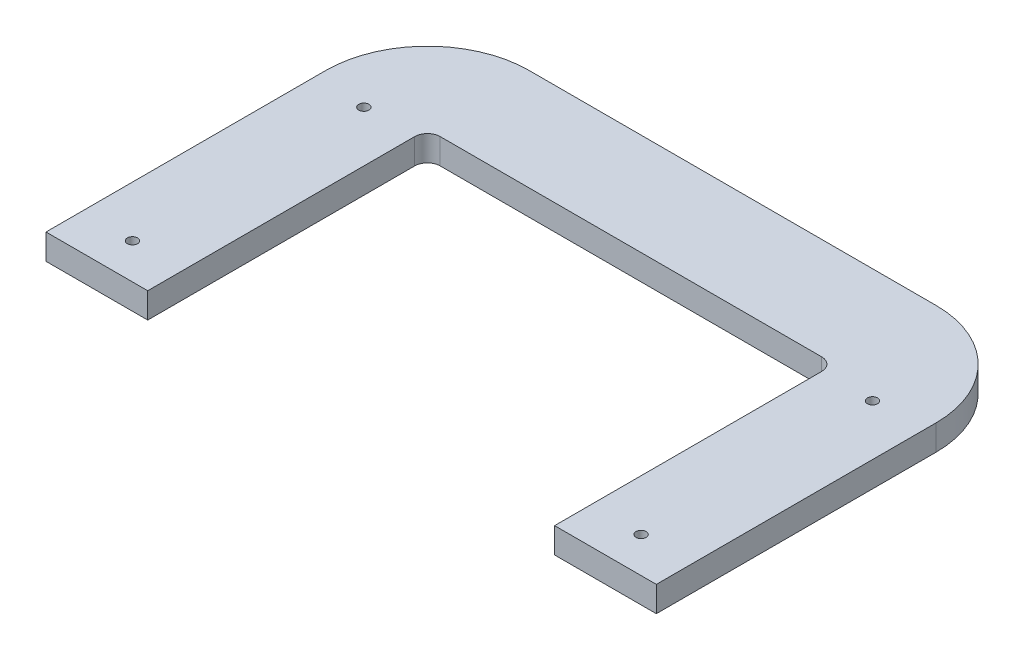
ISO-10303-21;
HEADER;
FILE_DESCRIPTION(('STEP AP214'),'2;1');
FILE_NAME('part.step','',(''),(''),'','','');
FILE_SCHEMA(('AUTOMOTIVE_DESIGN { 1 0 10303 214 1 1 1 1 }'));
ENDSEC;
DATA;
#1=APPLICATION_CONTEXT('core data for automotive mechanical design processes');
#2=APPLICATION_PROTOCOL_DEFINITION('international standard','automotive_design',2000,#1);
#3=PRODUCT_CONTEXT('',#1,'mechanical');
#4=PRODUCT('Part','Part','',(#3));
#5=PRODUCT_RELATED_PRODUCT_CATEGORY('part','',(#4));
#6=PRODUCT_DEFINITION_FORMATION('','',#4);
#7=PRODUCT_DEFINITION_CONTEXT('part definition',#1,'design');
#8=PRODUCT_DEFINITION('design','',#6,#7);
#9=PRODUCT_DEFINITION_SHAPE('','',#8);
#10=(LENGTH_UNIT() NAMED_UNIT(*) SI_UNIT(.MILLI.,.METRE.));
#11=(NAMED_UNIT(*) PLANE_ANGLE_UNIT() SI_UNIT($,.RADIAN.));
#12=(NAMED_UNIT(*) SI_UNIT($,.STERADIAN.) SOLID_ANGLE_UNIT());
#13=UNCERTAINTY_MEASURE_WITH_UNIT(LENGTH_MEASURE(1.E-05),#10,'distance_accuracy_value','');
#14=(GEOMETRIC_REPRESENTATION_CONTEXT(3) GLOBAL_UNCERTAINTY_ASSIGNED_CONTEXT((#13)) GLOBAL_UNIT_ASSIGNED_CONTEXT((#10,
#11,#12)) REPRESENTATION_CONTEXT('',''));
#15=CARTESIAN_POINT('',(0.,0.,0.));
#16=DIRECTION('',(0.,0.,1.));
#17=DIRECTION('',(1.,0.,0.));
#18=AXIS2_PLACEMENT_3D('',#15,#16,#17);
#19=CARTESIAN_POINT('',(0.,10.,0.));
#20=DIRECTION('',(0.,-1.,0.));
#21=DIRECTION('',(0.,0.,-1.));
#22=AXIS2_PLACEMENT_3D('',#19,#20,#21);
#23=PLANE('',#22);
#24=DIRECTION('',(0.,0.,-1.));
#25=VECTOR('',#24,1.);
#26=CARTESIAN_POINT('',(120.,10.,-142.12555673157));
#27=LINE('',#26,#25);
#28=CARTESIAN_POINT('',(120.,10.,7.87444326843044));
#29=VERTEX_POINT('',#28);
#30=CARTESIAN_POINT('',(120.,10.,-102.12555673157));
#31=VERTEX_POINT('',#30);
#32=EDGE_CURVE('E231',#29,#31,#27,.T.);
#33=ORIENTED_EDGE('',*,*,#32,.T.);
#34=CARTESIAN_POINT('',(80.,10.,-102.12555673157));
#35=DIRECTION('',(0.,-1.,0.));
#36=DIRECTION('',(0.,0.,-1.));
#37=AXIS2_PLACEMENT_3D('',#34,#35,#36);
#38=CIRCLE('',#37,40.);
#39=CARTESIAN_POINT('',(80.,10.,-142.12555673157));
#40=VERTEX_POINT('',#39);
#41=EDGE_CURVE('E165',#31,#40,#38,.F.);
#42=ORIENTED_EDGE('',*,*,#41,.T.);
#43=DIRECTION('',(-1.,0.,0.));
#44=VECTOR('',#43,1.);
#45=CARTESIAN_POINT('',(-120.,10.,-142.12555673157));
#46=LINE('',#45,#44);
#47=CARTESIAN_POINT('',(-80.,10.,-142.12555673157));
#48=VERTEX_POINT('',#47);
#49=EDGE_CURVE('E242',#40,#48,#46,.T.);
#50=ORIENTED_EDGE('',*,*,#49,.T.);
#51=CARTESIAN_POINT('',(-80.,10.,-102.12555673157));
#52=DIRECTION('',(0.,-1.,0.));
#53=DIRECTION('',(0.,0.,-1.));
#54=AXIS2_PLACEMENT_3D('',#51,#52,#53);
#55=CIRCLE('',#54,40.);
#56=CARTESIAN_POINT('',(-120.,10.,-102.12555673157));
#57=VERTEX_POINT('',#56);
#58=EDGE_CURVE('E163',#48,#57,#55,.F.);
#59=ORIENTED_EDGE('',*,*,#58,.T.);
#60=DIRECTION('',(0.,0.,1.));
#61=VECTOR('',#60,1.);
#62=CARTESIAN_POINT('',(-120.,10.,-142.12555673157));
#63=LINE('',#62,#61);
#64=CARTESIAN_POINT('',(-120.,10.,7.87444326843044));
#65=VERTEX_POINT('',#64);
#66=EDGE_CURVE('E136',#57,#65,#63,.T.);
#67=ORIENTED_EDGE('',*,*,#66,.T.);
#68=DIRECTION('',(1.,0.,0.));
#69=VECTOR('',#68,1.);
#70=CARTESIAN_POINT('',(-120.,10.,7.87444326843044));
#71=LINE('',#70,#69);
#72=CARTESIAN_POINT('',(-80.,10.,7.87444326843044));
#73=VERTEX_POINT('',#72);
#74=EDGE_CURVE('E130',#65,#73,#71,.T.);
#75=ORIENTED_EDGE('',*,*,#74,.T.);
#76=DIRECTION('',(0.,0.,-1.));
#77=VECTOR('',#76,1.);
#78=CARTESIAN_POINT('',(-80.,10.,-102.12555673157));
#79=LINE('',#78,#77);
#80=CARTESIAN_POINT('',(-80.,10.,-97.1255567315696));
#81=VERTEX_POINT('',#80);
#82=EDGE_CURVE('E121',#73,#81,#79,.T.);
#83=ORIENTED_EDGE('',*,*,#82,.T.);
#84=CARTESIAN_POINT('',(-75.,10.,-97.1255567315696));
#85=DIRECTION('',(0.,-1.,0.));
#86=DIRECTION('',(0.,0.,-1.));
#87=AXIS2_PLACEMENT_3D('',#84,#85,#86);
#88=CIRCLE('',#87,5.);
#89=CARTESIAN_POINT('',(-75.,10.,-102.12555673157));
#90=VERTEX_POINT('',#89);
#91=EDGE_CURVE('E11',#81,#90,#88,.T.);
#92=ORIENTED_EDGE('',*,*,#91,.T.);
#93=DIRECTION('',(1.,0.,0.));
#94=VECTOR('',#93,1.);
#95=CARTESIAN_POINT('',(-80.,10.,-102.12555673157));
#96=LINE('',#95,#94);
#97=CARTESIAN_POINT('',(75.,10.,-102.12555673157));
#98=VERTEX_POINT('',#97);
#99=EDGE_CURVE('E129',#90,#98,#96,.T.);
#100=ORIENTED_EDGE('',*,*,#99,.T.);
#101=CARTESIAN_POINT('',(75.,10.,-97.1255567315696));
#102=DIRECTION('',(0.,-1.,0.));
#103=DIRECTION('',(0.,0.,-1.));
#104=AXIS2_PLACEMENT_3D('',#101,#102,#103);
#105=CIRCLE('',#104,5.);
#106=CARTESIAN_POINT('',(80.,10.,-97.1255567315696));
#107=VERTEX_POINT('',#106);
#108=EDGE_CURVE('E181',#98,#107,#105,.T.);
#109=ORIENTED_EDGE('',*,*,#108,.T.);
#110=DIRECTION('',(0.,0.,1.));
#111=VECTOR('',#110,1.);
#112=CARTESIAN_POINT('',(80.,10.,-102.12555673157));
#113=LINE('',#112,#111);
#114=CARTESIAN_POINT('',(80.,10.,7.87444326843044));
#115=VERTEX_POINT('',#114);
#116=EDGE_CURVE('E185',#107,#115,#113,.T.);
#117=ORIENTED_EDGE('',*,*,#116,.T.);
#118=DIRECTION('',(1.,0.,0.));
#119=VECTOR('',#118,1.);
#120=CARTESIAN_POINT('',(120.,10.,7.87444326843044));
#121=LINE('',#120,#119);
#122=EDGE_CURVE('E195',#115,#29,#121,.T.);
#123=ORIENTED_EDGE('',*,*,#122,.T.);
#124=EDGE_LOOP('',(#33,#42,#50,#59,#67,#75,#83,#92,#100,#109,#117,#123));
#125=FACE_BOUND('',#124,.T.);
#126=CARTESIAN_POINT('',(-100.,10.,-97.1255567315696));
#127=DIRECTION('',(0.,1.,0.));
#128=DIRECTION('',(0.,0.,1.));
#129=AXIS2_PLACEMENT_3D('',#126,#127,#128);
#130=CIRCLE('',#129,2.);
#131=CARTESIAN_POINT('',(-100.,10.,-95.1255567315696));
#132=VERTEX_POINT('',#131);
#133=EDGE_CURVE('E248',#132,#132,#130,.T.);
#134=ORIENTED_EDGE('',*,*,#133,.F.);
#135=EDGE_LOOP('',(#134));
#136=FACE_BOUND('',#135,.T.);
#137=CARTESIAN_POINT('',(100.,10.,-97.1255567315696));
#138=DIRECTION('',(0.,1.,0.));
#139=DIRECTION('',(0.,0.,-1.));
#140=AXIS2_PLACEMENT_3D('',#137,#138,#139);
#141=CIRCLE('',#140,2.);
#142=CARTESIAN_POINT('',(100.,10.,-99.1255567315696));
#143=VERTEX_POINT('',#142);
#144=EDGE_CURVE('E255',#143,#143,#141,.T.);
#145=ORIENTED_EDGE('',*,*,#144,.F.);
#146=EDGE_LOOP('',(#145));
#147=FACE_BOUND('',#146,.T.);
#148=CARTESIAN_POINT('',(-100.,10.,-6.12555673156957));
#149=DIRECTION('',(0.,1.,0.));
#150=DIRECTION('',(0.,0.,1.));
#151=AXIS2_PLACEMENT_3D('',#148,#149,#150);
#152=CIRCLE('',#151,2.);
#153=CARTESIAN_POINT('',(-100.,10.,-4.12555673156958));
#154=VERTEX_POINT('',#153);
#155=EDGE_CURVE('E431',#154,#154,#152,.T.);
#156=ORIENTED_EDGE('',*,*,#155,.F.);
#157=EDGE_LOOP('',(#156));
#158=FACE_BOUND('',#157,.T.);
#159=CARTESIAN_POINT('',(100.,10.,-6.12555673156957));
#160=DIRECTION('',(0.,1.,0.));
#161=DIRECTION('',(0.,0.,-1.));
#162=AXIS2_PLACEMENT_3D('',#159,#160,#161);
#163=CIRCLE('',#162,2.);
#164=CARTESIAN_POINT('',(100.,10.,-8.12555673156957));
#165=VERTEX_POINT('',#164);
#166=EDGE_CURVE('E422',#165,#165,#163,.T.);
#167=ORIENTED_EDGE('',*,*,#166,.F.);
#168=EDGE_LOOP('',(#167));
#169=FACE_BOUND('',#168,.T.);
#170=ADVANCED_FACE('F36',(#125,#136,#147,#158,#169),#23,.F.);
#171=CARTESIAN_POINT('',(0.,0.,0.));
#172=DIRECTION('',(0.,-1.,0.));
#173=DIRECTION('',(0.,0.,-1.));
#174=AXIS2_PLACEMENT_3D('',#171,#172,#173);
#175=PLANE('',#174);
#176=CARTESIAN_POINT('',(-100.,0.,-6.12555673156957));
#177=DIRECTION('',(0.,1.,0.));
#178=DIRECTION('',(0.,0.,1.));
#179=AXIS2_PLACEMENT_3D('',#176,#177,#178);
#180=CIRCLE('',#179,2.);
#181=CARTESIAN_POINT('',(-100.,0.,-4.12555673156958));
#182=VERTEX_POINT('',#181);
#183=EDGE_CURVE('E428',#182,#182,#180,.T.);
#184=ORIENTED_EDGE('',*,*,#183,.T.);
#185=EDGE_LOOP('',(#184));
#186=FACE_BOUND('',#185,.T.);
#187=CARTESIAN_POINT('',(-100.,0.,-97.1255567315696));
#188=DIRECTION('',(0.,1.,0.));
#189=DIRECTION('',(0.,0.,1.));
#190=AXIS2_PLACEMENT_3D('',#187,#188,#189);
#191=CIRCLE('',#190,2.);
#192=CARTESIAN_POINT('',(-100.,0.,-95.1255567315696));
#193=VERTEX_POINT('',#192);
#194=EDGE_CURVE('E250',#193,#193,#191,.T.);
#195=ORIENTED_EDGE('',*,*,#194,.T.);
#196=EDGE_LOOP('',(#195));
#197=FACE_BOUND('',#196,.T.);
#198=DIRECTION('',(-1.,0.,0.));
#199=VECTOR('',#198,1.);
#200=CARTESIAN_POINT('',(-120.,0.,-142.12555673157));
#201=LINE('',#200,#199);
#202=CARTESIAN_POINT('',(80.,0.,-142.12555673157));
#203=VERTEX_POINT('',#202);
#204=CARTESIAN_POINT('',(-80.,0.,-142.12555673157));
#205=VERTEX_POINT('',#204);
#206=EDGE_CURVE('E219',#203,#205,#201,.T.);
#207=ORIENTED_EDGE('',*,*,#206,.F.);
#208=CARTESIAN_POINT('',(80.,0.,-102.12555673157));
#209=DIRECTION('',(0.,-1.,0.));
#210=DIRECTION('',(0.,0.,-1.));
#211=AXIS2_PLACEMENT_3D('',#208,#209,#210);
#212=CIRCLE('',#211,40.);
#213=CARTESIAN_POINT('',(120.,0.,-102.12555673157));
#214=VERTEX_POINT('',#213);
#215=EDGE_CURVE('E159',#203,#214,#212,.T.);
#216=ORIENTED_EDGE('',*,*,#215,.T.);
#217=DIRECTION('',(0.,0.,-1.));
#218=VECTOR('',#217,1.);
#219=CARTESIAN_POINT('',(120.,0.,-142.12555673157));
#220=LINE('',#219,#218);
#221=CARTESIAN_POINT('',(120.,0.,7.87444326843044));
#222=VERTEX_POINT('',#221);
#223=EDGE_CURVE('E216',#222,#214,#220,.T.);
#224=ORIENTED_EDGE('',*,*,#223,.F.);
#225=DIRECTION('',(1.,0.,0.));
#226=VECTOR('',#225,1.);
#227=CARTESIAN_POINT('',(120.,0.,7.87444326843044));
#228=LINE('',#227,#226);
#229=CARTESIAN_POINT('',(80.,0.,7.87444326843044));
#230=VERTEX_POINT('',#229);
#231=EDGE_CURVE('E210',#230,#222,#228,.T.);
#232=ORIENTED_EDGE('',*,*,#231,.F.);
#233=DIRECTION('',(0.,0.,1.));
#234=VECTOR('',#233,1.);
#235=CARTESIAN_POINT('',(80.,0.,-102.12555673157));
#236=LINE('',#235,#234);
#237=CARTESIAN_POINT('',(80.,0.,-97.1255567315696));
#238=VERTEX_POINT('',#237);
#239=EDGE_CURVE('E204',#238,#230,#236,.T.);
#240=ORIENTED_EDGE('',*,*,#239,.F.);
#241=CARTESIAN_POINT('',(75.,0.,-97.1255567315696));
#242=DIRECTION('',(0.,-1.,0.));
#243=DIRECTION('',(0.,0.,-1.));
#244=AXIS2_PLACEMENT_3D('',#241,#242,#243);
#245=CIRCLE('',#244,5.);
#246=CARTESIAN_POINT('',(75.,0.,-102.12555673157));
#247=VERTEX_POINT('',#246);
#248=EDGE_CURVE('E179',#238,#247,#245,.F.);
#249=ORIENTED_EDGE('',*,*,#248,.T.);
#250=DIRECTION('',(1.,0.,0.));
#251=VECTOR('',#250,1.);
#252=CARTESIAN_POINT('',(-80.,0.,-102.12555673157));
#253=LINE('',#252,#251);
#254=CARTESIAN_POINT('',(-75.,0.,-102.12555673157));
#255=VERTEX_POINT('',#254);
#256=EDGE_CURVE('E202',#255,#247,#253,.T.);
#257=ORIENTED_EDGE('',*,*,#256,.F.);
#258=CARTESIAN_POINT('',(-75.,0.,-97.1255567315696));
#259=DIRECTION('',(0.,-1.,0.));
#260=DIRECTION('',(0.,0.,-1.));
#261=AXIS2_PLACEMENT_3D('',#258,#259,#260);
#262=CIRCLE('',#261,5.);
#263=CARTESIAN_POINT('',(-80.,0.,-97.1255567315696));
#264=VERTEX_POINT('',#263);
#265=EDGE_CURVE('E44',#255,#264,#262,.F.);
#266=ORIENTED_EDGE('',*,*,#265,.T.);
#267=DIRECTION('',(0.,0.,-1.));
#268=VECTOR('',#267,1.);
#269=CARTESIAN_POINT('',(-80.,0.,-102.12555673157));
#270=LINE('',#269,#268);
#271=CARTESIAN_POINT('',(-80.,0.,7.87444326843044));
#272=VERTEX_POINT('',#271);
#273=EDGE_CURVE('E208',#272,#264,#270,.T.);
#274=ORIENTED_EDGE('',*,*,#273,.F.);
#275=DIRECTION('',(1.,0.,0.));
#276=VECTOR('',#275,1.);
#277=CARTESIAN_POINT('',(-120.,0.,7.87444326843044));
#278=LINE('',#277,#276);
#279=CARTESIAN_POINT('',(-120.,0.,7.87444326843044));
#280=VERTEX_POINT('',#279);
#281=EDGE_CURVE('E144',#280,#272,#278,.T.);
#282=ORIENTED_EDGE('',*,*,#281,.F.);
#283=DIRECTION('',(0.,0.,1.));
#284=VECTOR('',#283,1.);
#285=CARTESIAN_POINT('',(-120.,0.,-142.12555673157));
#286=LINE('',#285,#284);
#287=CARTESIAN_POINT('',(-120.,0.,-102.12555673157));
#288=VERTEX_POINT('',#287);
#289=EDGE_CURVE('E140',#288,#280,#286,.T.);
#290=ORIENTED_EDGE('',*,*,#289,.F.);
#291=CARTESIAN_POINT('',(-80.,0.,-102.12555673157));
#292=DIRECTION('',(0.,-1.,0.));
#293=DIRECTION('',(0.,0.,-1.));
#294=AXIS2_PLACEMENT_3D('',#291,#292,#293);
#295=CIRCLE('',#294,40.);
#296=EDGE_CURVE('E157',#288,#205,#295,.T.);
#297=ORIENTED_EDGE('',*,*,#296,.T.);
#298=EDGE_LOOP('',(#207,#216,#224,#232,#240,#249,#257,#266,#274,#282,#290,#297));
#299=FACE_BOUND('',#298,.T.);
#300=CARTESIAN_POINT('',(100.,0.,-97.1255567315696));
#301=DIRECTION('',(0.,1.,0.));
#302=DIRECTION('',(0.,0.,-1.));
#303=AXIS2_PLACEMENT_3D('',#300,#301,#302);
#304=CIRCLE('',#303,2.);
#305=CARTESIAN_POINT('',(100.,0.,-99.1255567315696));
#306=VERTEX_POINT('',#305);
#307=EDGE_CURVE('E258',#306,#306,#304,.T.);
#308=ORIENTED_EDGE('',*,*,#307,.T.);
#309=EDGE_LOOP('',(#308));
#310=FACE_BOUND('',#309,.T.);
#311=CARTESIAN_POINT('',(100.,0.,-6.12555673156957));
#312=DIRECTION('',(0.,1.,0.));
#313=DIRECTION('',(0.,0.,-1.));
#314=AXIS2_PLACEMENT_3D('',#311,#312,#313);
#315=CIRCLE('',#314,2.);
#316=CARTESIAN_POINT('',(100.,0.,-8.12555673156957));
#317=VERTEX_POINT('',#316);
#318=EDGE_CURVE('E425',#317,#317,#315,.T.);
#319=ORIENTED_EDGE('',*,*,#318,.T.);
#320=EDGE_LOOP('',(#319));
#321=FACE_BOUND('',#320,.T.);
#322=ADVANCED_FACE('F200',(#186,#197,#299,#310,#321),#175,.T.);
#323=CARTESIAN_POINT('',(-120.,10.,7.87444326843044));
#324=DIRECTION('',(0.,0.,-1.));
#325=DIRECTION('',(-1.,0.,0.));
#326=AXIS2_PLACEMENT_3D('',#323,#324,#325);
#327=PLANE('',#326);
#328=ORIENTED_EDGE('',*,*,#281,.T.);
#329=DIRECTION('',(0.,-1.,0.));
#330=VECTOR('',#329,1.);
#331=CARTESIAN_POINT('',(-80.,10.,7.87444326843044));
#332=LINE('',#331,#330);
#333=EDGE_CURVE('E125',#73,#272,#332,.T.);
#334=ORIENTED_EDGE('',*,*,#333,.F.);
#335=ORIENTED_EDGE('',*,*,#74,.F.);
#336=DIRECTION('',(0.,-1.,0.));
#337=VECTOR('',#336,1.);
#338=CARTESIAN_POINT('',(-120.,10.,7.87444326843044));
#339=LINE('',#338,#337);
#340=EDGE_CURVE('E223',#65,#280,#339,.T.);
#341=ORIENTED_EDGE('',*,*,#340,.T.);
#342=EDGE_LOOP('',(#328,#334,#335,#341));
#343=FACE_BOUND('',#342,.T.);
#344=ADVANCED_FACE('F142',(#343),#327,.F.);
#345=CARTESIAN_POINT('',(-80.,10.,-102.12555673157));
#346=DIRECTION('',(-1.,0.,0.));
#347=DIRECTION('',(0.,0.,1.));
#348=AXIS2_PLACEMENT_3D('',#345,#346,#347);
#349=PLANE('',#348);
#350=ORIENTED_EDGE('',*,*,#273,.T.);
#351=DIRECTION('',(0.,-1.,0.));
#352=VECTOR('',#351,1.);
#353=CARTESIAN_POINT('',(-80.,10.,-97.1255567315696));
#354=LINE('',#353,#352);
#355=EDGE_CURVE('E51',#264,#81,#354,.F.);
#356=ORIENTED_EDGE('',*,*,#355,.T.);
#357=ORIENTED_EDGE('',*,*,#82,.F.);
#358=ORIENTED_EDGE('',*,*,#333,.T.);
#359=EDGE_LOOP('',(#350,#356,#357,#358));
#360=FACE_BOUND('',#359,.T.);
#361=ADVANCED_FACE('F123',(#360),#349,.F.);
#362=CARTESIAN_POINT('',(-80.,10.,-102.12555673157));
#363=DIRECTION('',(0.,0.,-1.));
#364=DIRECTION('',(-1.,0.,0.));
#365=AXIS2_PLACEMENT_3D('',#362,#363,#364);
#366=PLANE('',#365);
#367=ORIENTED_EDGE('',*,*,#256,.T.);
#368=DIRECTION('',(0.,-1.,0.));
#369=VECTOR('',#368,1.);
#370=CARTESIAN_POINT('',(75.,10.,-102.12555673157));
#371=LINE('',#370,#369);
#372=EDGE_CURVE('E176',#247,#98,#371,.F.);
#373=ORIENTED_EDGE('',*,*,#372,.T.);
#374=ORIENTED_EDGE('',*,*,#99,.F.);
#375=DIRECTION('',(0.,-1.,0.));
#376=VECTOR('',#375,1.);
#377=CARTESIAN_POINT('',(-75.,0.,-102.12555673157));
#378=LINE('',#377,#376);
#379=EDGE_CURVE('E173',#90,#255,#378,.T.);
#380=ORIENTED_EDGE('',*,*,#379,.T.);
#381=EDGE_LOOP('',(#367,#373,#374,#380));
#382=FACE_BOUND('',#381,.T.);
#383=ADVANCED_FACE('F206',(#382),#366,.F.);
#384=CARTESIAN_POINT('',(80.,10.,-102.12555673157));
#385=DIRECTION('',(1.,0.,0.));
#386=DIRECTION('',(0.,0.,-1.));
#387=AXIS2_PLACEMENT_3D('',#384,#385,#386);
#388=PLANE('',#387);
#389=ORIENTED_EDGE('',*,*,#116,.F.);
#390=DIRECTION('',(0.,-1.,0.));
#391=VECTOR('',#390,1.);
#392=CARTESIAN_POINT('',(80.,0.,-97.1255567315696));
#393=LINE('',#392,#391);
#394=EDGE_CURVE('E170',#107,#238,#393,.T.);
#395=ORIENTED_EDGE('',*,*,#394,.T.);
#396=ORIENTED_EDGE('',*,*,#239,.T.);
#397=DIRECTION('',(0.,-1.,0.));
#398=VECTOR('',#397,1.);
#399=CARTESIAN_POINT('',(80.,10.,7.87444326843044));
#400=LINE('',#399,#398);
#401=EDGE_CURVE('E146',#115,#230,#400,.T.);
#402=ORIENTED_EDGE('',*,*,#401,.F.);
#403=EDGE_LOOP('',(#389,#395,#396,#402));
#404=FACE_BOUND('',#403,.T.);
#405=ADVANCED_FACE('F192',(#404),#388,.F.);
#406=CARTESIAN_POINT('',(120.,10.,7.87444326843044));
#407=DIRECTION('',(0.,0.,-1.));
#408=DIRECTION('',(-1.,0.,0.));
#409=AXIS2_PLACEMENT_3D('',#406,#407,#408);
#410=PLANE('',#409);
#411=ORIENTED_EDGE('',*,*,#231,.T.);
#412=DIRECTION('',(0.,-1.,0.));
#413=VECTOR('',#412,1.);
#414=CARTESIAN_POINT('',(120.,10.,7.87444326843044));
#415=LINE('',#414,#413);
#416=EDGE_CURVE('E151',#29,#222,#415,.T.);
#417=ORIENTED_EDGE('',*,*,#416,.F.);
#418=ORIENTED_EDGE('',*,*,#122,.F.);
#419=ORIENTED_EDGE('',*,*,#401,.T.);
#420=EDGE_LOOP('',(#411,#417,#418,#419));
#421=FACE_BOUND('',#420,.T.);
#422=ADVANCED_FACE('F261',(#421),#410,.F.);
#423=CARTESIAN_POINT('',(120.,10.,-142.12555673157));
#424=DIRECTION('',(-1.,0.,0.));
#425=DIRECTION('',(0.,0.,1.));
#426=AXIS2_PLACEMENT_3D('',#423,#424,#425);
#427=PLANE('',#426);
#428=ORIENTED_EDGE('',*,*,#223,.T.);
#429=DIRECTION('',(0.,-1.,0.));
#430=VECTOR('',#429,1.);
#431=CARTESIAN_POINT('',(120.,10.,-102.12555673157));
#432=LINE('',#431,#430);
#433=EDGE_CURVE('E161',#214,#31,#432,.F.);
#434=ORIENTED_EDGE('',*,*,#433,.T.);
#435=ORIENTED_EDGE('',*,*,#32,.F.);
#436=ORIENTED_EDGE('',*,*,#416,.T.);
#437=EDGE_LOOP('',(#428,#434,#435,#436));
#438=FACE_BOUND('',#437,.T.);
#439=ADVANCED_FACE('F229',(#438),#427,.F.);
#440=CARTESIAN_POINT('',(-120.,10.,-142.12555673157));
#441=DIRECTION('',(0.,0.,1.));
#442=DIRECTION('',(1.,0.,0.));
#443=AXIS2_PLACEMENT_3D('',#440,#441,#442);
#444=PLANE('',#443);
#445=ORIENTED_EDGE('',*,*,#49,.F.);
#446=DIRECTION('',(0.,-1.,0.));
#447=VECTOR('',#446,1.);
#448=CARTESIAN_POINT('',(80.,10.,-142.12555673157));
#449=LINE('',#448,#447);
#450=EDGE_CURVE('E148',#40,#203,#449,.T.);
#451=ORIENTED_EDGE('',*,*,#450,.T.);
#452=ORIENTED_EDGE('',*,*,#206,.T.);
#453=DIRECTION('',(0.,-1.,0.));
#454=VECTOR('',#453,1.);
#455=CARTESIAN_POINT('',(-80.,10.,-142.12555673157));
#456=LINE('',#455,#454);
#457=EDGE_CURVE('E145',#205,#48,#456,.F.);
#458=ORIENTED_EDGE('',*,*,#457,.T.);
#459=EDGE_LOOP('',(#445,#451,#452,#458));
#460=FACE_BOUND('',#459,.T.);
#461=ADVANCED_FACE('F239',(#460),#444,.F.);
#462=CARTESIAN_POINT('',(-120.,10.,-142.12555673157));
#463=DIRECTION('',(1.,0.,0.));
#464=DIRECTION('',(0.,0.,-1.));
#465=AXIS2_PLACEMENT_3D('',#462,#463,#464);
#466=PLANE('',#465);
#467=ORIENTED_EDGE('',*,*,#66,.F.);
#468=DIRECTION('',(0.,-1.,0.));
#469=VECTOR('',#468,1.);
#470=CARTESIAN_POINT('',(-120.,10.,-102.12555673157));
#471=LINE('',#470,#469);
#472=EDGE_CURVE('E167',#57,#288,#471,.T.);
#473=ORIENTED_EDGE('',*,*,#472,.T.);
#474=ORIENTED_EDGE('',*,*,#289,.T.);
#475=ORIENTED_EDGE('',*,*,#340,.F.);
#476=EDGE_LOOP('',(#467,#473,#474,#475));
#477=FACE_BOUND('',#476,.T.);
#478=ADVANCED_FACE('F281',(#477),#466,.F.);
#479=CARTESIAN_POINT('',(-100.,10.,-97.1255567315696));
#480=DIRECTION('',(0.,-1.,0.));
#481=DIRECTION('',(0.,0.,-1.));
#482=AXIS2_PLACEMENT_3D('',#479,#480,#481);
#483=CYLINDRICAL_SURFACE('',#482,2.);
#484=ORIENTED_EDGE('',*,*,#133,.T.);
#485=EDGE_LOOP('',(#484));
#486=FACE_BOUND('',#485,.T.);
#487=ORIENTED_EDGE('',*,*,#194,.F.);
#488=EDGE_LOOP('',(#487));
#489=FACE_BOUND('',#488,.T.);
#490=ADVANCED_FACE('F278',(#486,#489),#483,.F.);
#491=CARTESIAN_POINT('',(100.,10.,-97.1255567315696));
#492=DIRECTION('',(0.,-1.,0.));
#493=DIRECTION('',(0.,0.,-1.));
#494=AXIS2_PLACEMENT_3D('',#491,#492,#493);
#495=CYLINDRICAL_SURFACE('',#494,2.);
#496=ORIENTED_EDGE('',*,*,#144,.T.);
#497=EDGE_LOOP('',(#496));
#498=FACE_BOUND('',#497,.T.);
#499=ORIENTED_EDGE('',*,*,#307,.F.);
#500=EDGE_LOOP('',(#499));
#501=FACE_BOUND('',#500,.T.);
#502=ADVANCED_FACE('F301',(#498,#501),#495,.F.);
#503=CARTESIAN_POINT('',(-100.,10.,-6.12555673156957));
#504=DIRECTION('',(0.,-1.,0.));
#505=DIRECTION('',(0.,0.,-1.));
#506=AXIS2_PLACEMENT_3D('',#503,#504,#505);
#507=CYLINDRICAL_SURFACE('',#506,2.);
#508=ORIENTED_EDGE('',*,*,#155,.T.);
#509=EDGE_LOOP('',(#508));
#510=FACE_BOUND('',#509,.T.);
#511=ORIENTED_EDGE('',*,*,#183,.F.);
#512=EDGE_LOOP('',(#511));
#513=FACE_BOUND('',#512,.T.);
#514=ADVANCED_FACE('F307',(#510,#513),#507,.F.);
#515=CARTESIAN_POINT('',(100.,10.,-6.12555673156957));
#516=DIRECTION('',(0.,-1.,0.));
#517=DIRECTION('',(0.,0.,-1.));
#518=AXIS2_PLACEMENT_3D('',#515,#516,#517);
#519=CYLINDRICAL_SURFACE('',#518,2.);
#520=ORIENTED_EDGE('',*,*,#166,.T.);
#521=EDGE_LOOP('',(#520));
#522=FACE_BOUND('',#521,.T.);
#523=ORIENTED_EDGE('',*,*,#318,.F.);
#524=EDGE_LOOP('',(#523));
#525=FACE_BOUND('',#524,.T.);
#526=ADVANCED_FACE('F314',(#522,#525),#519,.F.);
#527=CARTESIAN_POINT('',(80.,10.,-102.12555673157));
#528=DIRECTION('',(0.,-1.,0.));
#529=DIRECTION('',(0.,0.,-1.));
#530=AXIS2_PLACEMENT_3D('',#527,#528,#529);
#531=CYLINDRICAL_SURFACE('',#530,40.);
#532=ORIENTED_EDGE('',*,*,#41,.F.);
#533=ORIENTED_EDGE('',*,*,#433,.F.);
#534=ORIENTED_EDGE('',*,*,#215,.F.);
#535=ORIENTED_EDGE('',*,*,#450,.F.);
#536=EDGE_LOOP('',(#532,#533,#534,#535));
#537=FACE_BOUND('',#536,.T.);
#538=ADVANCED_FACE('F236',(#537),#531,.T.);
#539=CARTESIAN_POINT('',(-80.,10.,-102.12555673157));
#540=DIRECTION('',(0.,-1.,0.));
#541=DIRECTION('',(0.,0.,-1.));
#542=AXIS2_PLACEMENT_3D('',#539,#540,#541);
#543=CYLINDRICAL_SURFACE('',#542,40.);
#544=ORIENTED_EDGE('',*,*,#58,.F.);
#545=ORIENTED_EDGE('',*,*,#457,.F.);
#546=ORIENTED_EDGE('',*,*,#296,.F.);
#547=ORIENTED_EDGE('',*,*,#472,.F.);
#548=EDGE_LOOP('',(#544,#545,#546,#547));
#549=FACE_BOUND('',#548,.T.);
#550=ADVANCED_FACE('F328',(#549),#543,.T.);
#551=CARTESIAN_POINT('',(75.,10.,-97.1255567315696));
#552=DIRECTION('',(0.,1.,0.));
#553=DIRECTION('',(0.,0.,1.));
#554=AXIS2_PLACEMENT_3D('',#551,#552,#553);
#555=CYLINDRICAL_SURFACE('',#554,5.);
#556=ORIENTED_EDGE('',*,*,#108,.F.);
#557=ORIENTED_EDGE('',*,*,#372,.F.);
#558=ORIENTED_EDGE('',*,*,#248,.F.);
#559=ORIENTED_EDGE('',*,*,#394,.F.);
#560=EDGE_LOOP('',(#556,#557,#558,#559));
#561=FACE_BOUND('',#560,.T.);
#562=ADVANCED_FACE('F197',(#561),#555,.F.);
#563=CARTESIAN_POINT('',(-75.,10.,-97.1255567315696));
#564=DIRECTION('',(0.,1.,0.));
#565=DIRECTION('',(0.,0.,1.));
#566=AXIS2_PLACEMENT_3D('',#563,#564,#565);
#567=CYLINDRICAL_SURFACE('',#566,5.);
#568=ORIENTED_EDGE('',*,*,#91,.F.);
#569=ORIENTED_EDGE('',*,*,#355,.F.);
#570=ORIENTED_EDGE('',*,*,#265,.F.);
#571=ORIENTED_EDGE('',*,*,#379,.F.);
#572=EDGE_LOOP('',(#568,#569,#570,#571));
#573=FACE_BOUND('',#572,.T.);
#574=ADVANCED_FACE('F38',(#573),#567,.F.);
#575=CLOSED_SHELL('',(#170,#322,#344,#361,#383,#405,#422,#439,#461,#478,#490,#502,#514,#526,
#538,#550,#562,#574));
#576=MANIFOLD_SOLID_BREP('B2',#575);
#577=ADVANCED_BREP_SHAPE_REPRESENTATION('',(#18,#576),#14);
#578=SHAPE_DEFINITION_REPRESENTATION(#9,#577);
ENDSEC;
END-ISO-10303-21;
